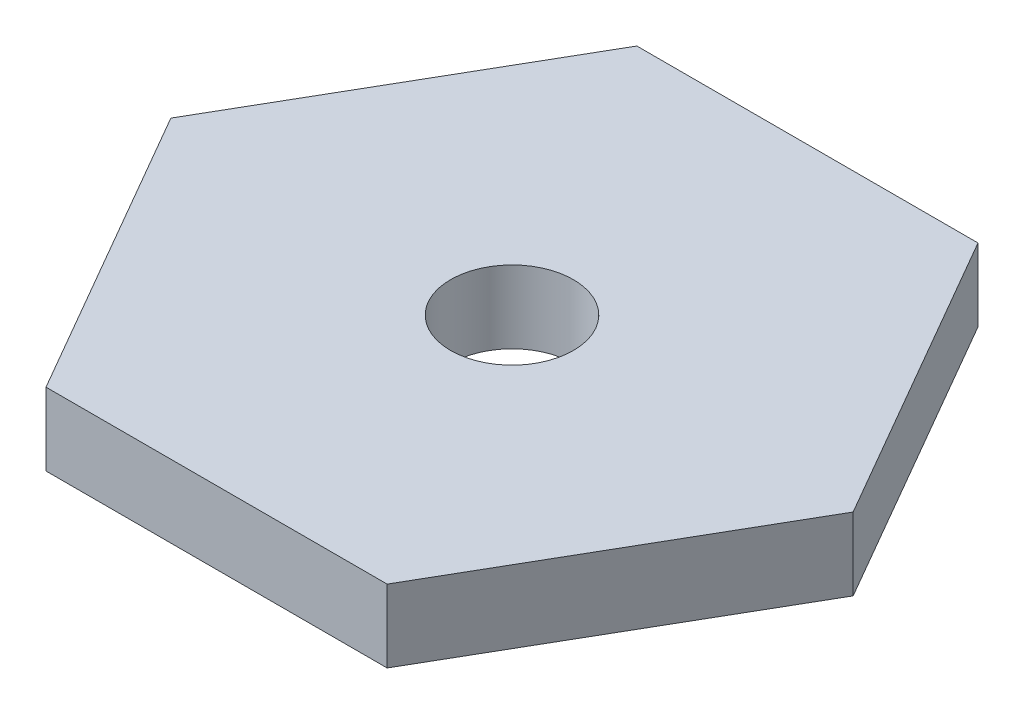
ISO-10303-21;
HEADER;
FILE_DESCRIPTION(('STEP AP214'),'2;1');
FILE_NAME('part.step','',(''),(''),'','','');
FILE_SCHEMA(('AUTOMOTIVE_DESIGN { 1 0 10303 214 1 1 1 1 }'));
ENDSEC;
DATA;
#1=APPLICATION_CONTEXT('core data for automotive mechanical design processes');
#2=APPLICATION_PROTOCOL_DEFINITION('international standard','automotive_design',2000,#1);
#3=PRODUCT_CONTEXT('',#1,'mechanical');
#4=PRODUCT('Part','Part','',(#3));
#5=PRODUCT_RELATED_PRODUCT_CATEGORY('part','',(#4));
#6=PRODUCT_DEFINITION_FORMATION('','',#4);
#7=PRODUCT_DEFINITION_CONTEXT('part definition',#1,'design');
#8=PRODUCT_DEFINITION('design','',#6,#7);
#9=PRODUCT_DEFINITION_SHAPE('','',#8);
#10=(LENGTH_UNIT() NAMED_UNIT(*) SI_UNIT(.MILLI.,.METRE.));
#11=(NAMED_UNIT(*) PLANE_ANGLE_UNIT() SI_UNIT($,.RADIAN.));
#12=(NAMED_UNIT(*) SI_UNIT($,.STERADIAN.) SOLID_ANGLE_UNIT());
#13=UNCERTAINTY_MEASURE_WITH_UNIT(LENGTH_MEASURE(1.E-05),#10,'distance_accuracy_value','');
#14=(GEOMETRIC_REPRESENTATION_CONTEXT(3) GLOBAL_UNCERTAINTY_ASSIGNED_CONTEXT((#13)) GLOBAL_UNIT_ASSIGNED_CONTEXT((#10,
#11,#12)) REPRESENTATION_CONTEXT('',''));
#15=CARTESIAN_POINT('',(0.,0.,0.));
#16=DIRECTION('',(0.,0.,1.));
#17=DIRECTION('',(1.,0.,0.));
#18=AXIS2_PLACEMENT_3D('',#15,#16,#17);
#19=CARTESIAN_POINT('',(52.9141521712292,11.27,0.));
#20=DIRECTION('',(-0.866025403784439,0.,0.5));
#21=DIRECTION('',(0.5,0.,0.866025403784439));
#22=AXIS2_PLACEMENT_3D('',#19,#20,#21);
#23=PLANE('',#22);
#24=DIRECTION('',(-0.5,0.,-0.866025403784439));
#25=VECTOR('',#24,1.);
#26=CARTESIAN_POINT('',(52.9141521712292,0.,0.));
#27=LINE('',#26,#25);
#28=CARTESIAN_POINT('',(52.9141521712292,0.,0.));
#29=VERTEX_POINT('',#28);
#30=CARTESIAN_POINT('',(26.4570760856146,0.,-45.825));
#31=VERTEX_POINT('',#30);
#32=EDGE_CURVE('E117',#29,#31,#27,.T.);
#33=ORIENTED_EDGE('',*,*,#32,.T.);
#34=DIRECTION('',(0.,-1.,0.));
#35=VECTOR('',#34,1.);
#36=CARTESIAN_POINT('',(26.4570760856146,11.27,-45.825));
#37=LINE('',#36,#35);
#38=CARTESIAN_POINT('',(26.4570760856146,11.27,-45.825));
#39=VERTEX_POINT('',#38);
#40=EDGE_CURVE('E11',#39,#31,#37,.T.);
#41=ORIENTED_EDGE('',*,*,#40,.F.);
#42=DIRECTION('',(-0.5,0.,-0.866025403784439));
#43=VECTOR('',#42,1.);
#44=CARTESIAN_POINT('',(52.9141521712292,11.27,0.));
#45=LINE('',#44,#43);
#46=CARTESIAN_POINT('',(52.9141521712292,11.27,0.));
#47=VERTEX_POINT('',#46);
#48=EDGE_CURVE('E128',#47,#39,#45,.T.);
#49=ORIENTED_EDGE('',*,*,#48,.F.);
#50=DIRECTION('',(0.,-1.,0.));
#51=VECTOR('',#50,1.);
#52=CARTESIAN_POINT('',(52.9141521712292,11.27,0.));
#53=LINE('',#52,#51);
#54=EDGE_CURVE('E113',#47,#29,#53,.T.);
#55=ORIENTED_EDGE('',*,*,#54,.T.);
#56=EDGE_LOOP('',(#33,#41,#49,#55));
#57=FACE_BOUND('',#56,.T.);
#58=ADVANCED_FACE('F33',(#57),#23,.F.);
#59=CARTESIAN_POINT('',(26.4570760856146,11.27,-45.825));
#60=DIRECTION('',(0.,0.,1.));
#61=DIRECTION('',(1.,0.,0.));
#62=AXIS2_PLACEMENT_3D('',#59,#60,#61);
#63=PLANE('',#62);
#64=DIRECTION('',(-1.,0.,0.));
#65=VECTOR('',#64,1.);
#66=CARTESIAN_POINT('',(26.4570760856146,0.,-45.825));
#67=LINE('',#66,#65);
#68=CARTESIAN_POINT('',(-26.4570760856146,0.,-45.825));
#69=VERTEX_POINT('',#68);
#70=EDGE_CURVE('E120',#31,#69,#67,.T.);
#71=ORIENTED_EDGE('',*,*,#70,.T.);
#72=DIRECTION('',(0.,-1.,0.));
#73=VECTOR('',#72,1.);
#74=CARTESIAN_POINT('',(-26.4570760856146,11.27,-45.825));
#75=LINE('',#74,#73);
#76=CARTESIAN_POINT('',(-26.4570760856146,11.27,-45.825));
#77=VERTEX_POINT('',#76);
#78=EDGE_CURVE('E41',#77,#69,#75,.T.);
#79=ORIENTED_EDGE('',*,*,#78,.F.);
#80=DIRECTION('',(-1.,0.,0.));
#81=VECTOR('',#80,1.);
#82=CARTESIAN_POINT('',(26.4570760856146,11.27,-45.825));
#83=LINE('',#82,#81);
#84=EDGE_CURVE('E86',#39,#77,#83,.T.);
#85=ORIENTED_EDGE('',*,*,#84,.F.);
#86=ORIENTED_EDGE('',*,*,#40,.T.);
#87=EDGE_LOOP('',(#71,#79,#85,#86));
#88=FACE_BOUND('',#87,.T.);
#89=ADVANCED_FACE('F153',(#88),#63,.F.);
#90=CARTESIAN_POINT('',(-26.4570760856146,11.27,-45.825));
#91=DIRECTION('',(0.866025403784439,0.,0.5));
#92=DIRECTION('',(0.5,0.,-0.866025403784439));
#93=AXIS2_PLACEMENT_3D('',#90,#91,#92);
#94=PLANE('',#93);
#95=DIRECTION('',(-0.5,0.,0.866025403784439));
#96=VECTOR('',#95,1.);
#97=CARTESIAN_POINT('',(-26.4570760856146,0.,-45.825));
#98=LINE('',#97,#96);
#99=CARTESIAN_POINT('',(-52.9141521712292,0.,0.));
#100=VERTEX_POINT('',#99);
#101=EDGE_CURVE('E123',#69,#100,#98,.T.);
#102=ORIENTED_EDGE('',*,*,#101,.T.);
#103=DIRECTION('',(0.,-1.,0.));
#104=VECTOR('',#103,1.);
#105=CARTESIAN_POINT('',(-52.9141521712292,11.27,0.));
#106=LINE('',#105,#104);
#107=CARTESIAN_POINT('',(-52.9141521712292,11.27,0.));
#108=VERTEX_POINT('',#107);
#109=EDGE_CURVE('E108',#108,#100,#106,.T.);
#110=ORIENTED_EDGE('',*,*,#109,.F.);
#111=DIRECTION('',(-0.5,0.,0.866025403784439));
#112=VECTOR('',#111,1.);
#113=CARTESIAN_POINT('',(-26.4570760856146,11.27,-45.825));
#114=LINE('',#113,#112);
#115=EDGE_CURVE('E99',#77,#108,#114,.T.);
#116=ORIENTED_EDGE('',*,*,#115,.F.);
#117=ORIENTED_EDGE('',*,*,#78,.T.);
#118=EDGE_LOOP('',(#102,#110,#116,#117));
#119=FACE_BOUND('',#118,.T.);
#120=ADVANCED_FACE('F134',(#119),#94,.F.);
#121=CARTESIAN_POINT('',(-52.9141521712292,11.27,0.));
#122=DIRECTION('',(0.866025403784439,0.,-0.5));
#123=DIRECTION('',(-0.5,0.,-0.866025403784439));
#124=AXIS2_PLACEMENT_3D('',#121,#122,#123);
#125=PLANE('',#124);
#126=DIRECTION('',(0.5,0.,0.866025403784439));
#127=VECTOR('',#126,1.);
#128=CARTESIAN_POINT('',(-52.9141521712292,0.,0.));
#129=LINE('',#128,#127);
#130=CARTESIAN_POINT('',(-26.4570760856146,0.,45.825));
#131=VERTEX_POINT('',#130);
#132=EDGE_CURVE('E107',#100,#131,#129,.T.);
#133=ORIENTED_EDGE('',*,*,#132,.T.);
#134=DIRECTION('',(0.,-1.,0.));
#135=VECTOR('',#134,1.);
#136=CARTESIAN_POINT('',(-26.4570760856146,11.27,45.825));
#137=LINE('',#136,#135);
#138=CARTESIAN_POINT('',(-26.4570760856146,11.27,45.825));
#139=VERTEX_POINT('',#138);
#140=EDGE_CURVE('E104',#139,#131,#137,.T.);
#141=ORIENTED_EDGE('',*,*,#140,.F.);
#142=DIRECTION('',(0.5,0.,0.866025403784439));
#143=VECTOR('',#142,1.);
#144=CARTESIAN_POINT('',(-52.9141521712292,11.27,0.));
#145=LINE('',#144,#143);
#146=EDGE_CURVE('E93',#108,#139,#145,.T.);
#147=ORIENTED_EDGE('',*,*,#146,.F.);
#148=ORIENTED_EDGE('',*,*,#109,.T.);
#149=EDGE_LOOP('',(#133,#141,#147,#148));
#150=FACE_BOUND('',#149,.T.);
#151=ADVANCED_FACE('F105',(#150),#125,.F.);
#152=CARTESIAN_POINT('',(-26.4570760856146,11.27,45.825));
#153=DIRECTION('',(0.,0.,-1.));
#154=DIRECTION('',(-1.,0.,0.));
#155=AXIS2_PLACEMENT_3D('',#152,#153,#154);
#156=PLANE('',#155);
#157=DIRECTION('',(1.,0.,0.));
#158=VECTOR('',#157,1.);
#159=CARTESIAN_POINT('',(-26.4570760856146,0.,45.825));
#160=LINE('',#159,#158);
#161=CARTESIAN_POINT('',(26.4570760856146,0.,45.825));
#162=VERTEX_POINT('',#161);
#163=EDGE_CURVE('E72',#131,#162,#160,.T.);
#164=ORIENTED_EDGE('',*,*,#163,.T.);
#165=DIRECTION('',(0.,-1.,0.));
#166=VECTOR('',#165,1.);
#167=CARTESIAN_POINT('',(26.4570760856146,11.27,45.825));
#168=LINE('',#167,#166);
#169=CARTESIAN_POINT('',(26.4570760856146,11.27,45.825));
#170=VERTEX_POINT('',#169);
#171=EDGE_CURVE('E109',#170,#162,#168,.T.);
#172=ORIENTED_EDGE('',*,*,#171,.F.);
#173=DIRECTION('',(1.,0.,0.));
#174=VECTOR('',#173,1.);
#175=CARTESIAN_POINT('',(-26.4570760856146,11.27,45.825));
#176=LINE('',#175,#174);
#177=EDGE_CURVE('E97',#139,#170,#176,.T.);
#178=ORIENTED_EDGE('',*,*,#177,.F.);
#179=ORIENTED_EDGE('',*,*,#140,.T.);
#180=EDGE_LOOP('',(#164,#172,#178,#179));
#181=FACE_BOUND('',#180,.T.);
#182=ADVANCED_FACE('F111',(#181),#156,.F.);
#183=CARTESIAN_POINT('',(26.4570760856146,11.27,45.825));
#184=DIRECTION('',(-0.866025403784439,0.,-0.5));
#185=DIRECTION('',(-0.5,0.,0.866025403784439));
#186=AXIS2_PLACEMENT_3D('',#183,#184,#185);
#187=PLANE('',#186);
#188=DIRECTION('',(0.5,0.,-0.866025403784439));
#189=VECTOR('',#188,1.);
#190=CARTESIAN_POINT('',(26.4570760856146,0.,45.825));
#191=LINE('',#190,#189);
#192=EDGE_CURVE('E78',#162,#29,#191,.T.);
#193=ORIENTED_EDGE('',*,*,#192,.T.);
#194=ORIENTED_EDGE('',*,*,#54,.F.);
#195=DIRECTION('',(0.5,0.,-0.866025403784439));
#196=VECTOR('',#195,1.);
#197=CARTESIAN_POINT('',(26.4570760856146,11.27,45.825));
#198=LINE('',#197,#196);
#199=EDGE_CURVE('E49',#170,#47,#198,.T.);
#200=ORIENTED_EDGE('',*,*,#199,.F.);
#201=ORIENTED_EDGE('',*,*,#171,.T.);
#202=EDGE_LOOP('',(#193,#194,#200,#201));
#203=FACE_BOUND('',#202,.T.);
#204=ADVANCED_FACE('F141',(#203),#187,.F.);
#205=CARTESIAN_POINT('',(0.,11.27,0.));
#206=DIRECTION('',(0.,1.,0.));
#207=DIRECTION('',(0.,0.,1.));
#208=AXIS2_PLACEMENT_3D('',#205,#206,#207);
#209=PLANE('',#208);
#210=CARTESIAN_POINT('',(0.,11.27,0.));
#211=DIRECTION('',(0.,1.,0.));
#212=DIRECTION('',(0.,0.,1.));
#213=AXIS2_PLACEMENT_3D('',#210,#211,#212);
#214=CIRCLE('',#213,9.525);
#215=CARTESIAN_POINT('',(0.,11.27,9.525));
#216=VERTEX_POINT('',#215);
#217=EDGE_CURVE('E208',#216,#216,#214,.T.);
#218=ORIENTED_EDGE('',*,*,#217,.F.);
#219=EDGE_LOOP('',(#218));
#220=FACE_BOUND('',#219,.T.);
#221=ORIENTED_EDGE('',*,*,#48,.T.);
#222=ORIENTED_EDGE('',*,*,#84,.T.);
#223=ORIENTED_EDGE('',*,*,#115,.T.);
#224=ORIENTED_EDGE('',*,*,#146,.T.);
#225=ORIENTED_EDGE('',*,*,#177,.T.);
#226=ORIENTED_EDGE('',*,*,#199,.T.);
#227=EDGE_LOOP('',(#221,#222,#223,#224,#225,#226));
#228=FACE_BOUND('',#227,.T.);
#229=ADVANCED_FACE('F95',(#220,#228),#209,.T.);
#230=CARTESIAN_POINT('',(0.,0.,0.));
#231=DIRECTION('',(0.,1.,0.));
#232=DIRECTION('',(0.,0.,1.));
#233=AXIS2_PLACEMENT_3D('',#230,#231,#232);
#234=PLANE('',#233);
#235=CARTESIAN_POINT('',(0.,0.,0.));
#236=DIRECTION('',(0.,1.,0.));
#237=DIRECTION('',(0.,0.,1.));
#238=AXIS2_PLACEMENT_3D('',#235,#236,#237);
#239=CIRCLE('',#238,9.525);
#240=CARTESIAN_POINT('',(0.,0.,9.525));
#241=VERTEX_POINT('',#240);
#242=EDGE_CURVE('E121',#241,#241,#239,.T.);
#243=ORIENTED_EDGE('',*,*,#242,.T.);
#244=EDGE_LOOP('',(#243));
#245=FACE_BOUND('',#244,.T.);
#246=ORIENTED_EDGE('',*,*,#32,.F.);
#247=ORIENTED_EDGE('',*,*,#192,.F.);
#248=ORIENTED_EDGE('',*,*,#163,.F.);
#249=ORIENTED_EDGE('',*,*,#132,.F.);
#250=ORIENTED_EDGE('',*,*,#101,.F.);
#251=ORIENTED_EDGE('',*,*,#70,.F.);
#252=EDGE_LOOP('',(#246,#247,#248,#249,#250,#251));
#253=FACE_BOUND('',#252,.T.);
#254=ADVANCED_FACE('F137',(#245,#253),#234,.F.);
#255=CARTESIAN_POINT('',(0.,0.,0.));
#256=DIRECTION('',(0.,1.,0.));
#257=DIRECTION('',(0.,0.,1.));
#258=AXIS2_PLACEMENT_3D('',#255,#256,#257);
#259=CYLINDRICAL_SURFACE('',#258,9.525);
#260=ORIENTED_EDGE('',*,*,#242,.F.);
#261=EDGE_LOOP('',(#260));
#262=FACE_BOUND('',#261,.T.);
#263=ORIENTED_EDGE('',*,*,#217,.T.);
#264=EDGE_LOOP('',(#263));
#265=FACE_BOUND('',#264,.T.);
#266=ADVANCED_FACE('F190',(#262,#265),#259,.F.);
#267=CLOSED_SHELL('',(#58,#89,#120,#151,#182,#204,#229,#254,#266));
#268=MANIFOLD_SOLID_BREP('B2',#267);
#269=ADVANCED_BREP_SHAPE_REPRESENTATION('',(#18,#268),#14);
#270=SHAPE_DEFINITION_REPRESENTATION(#9,#269);
ENDSEC;
END-ISO-10303-21;
